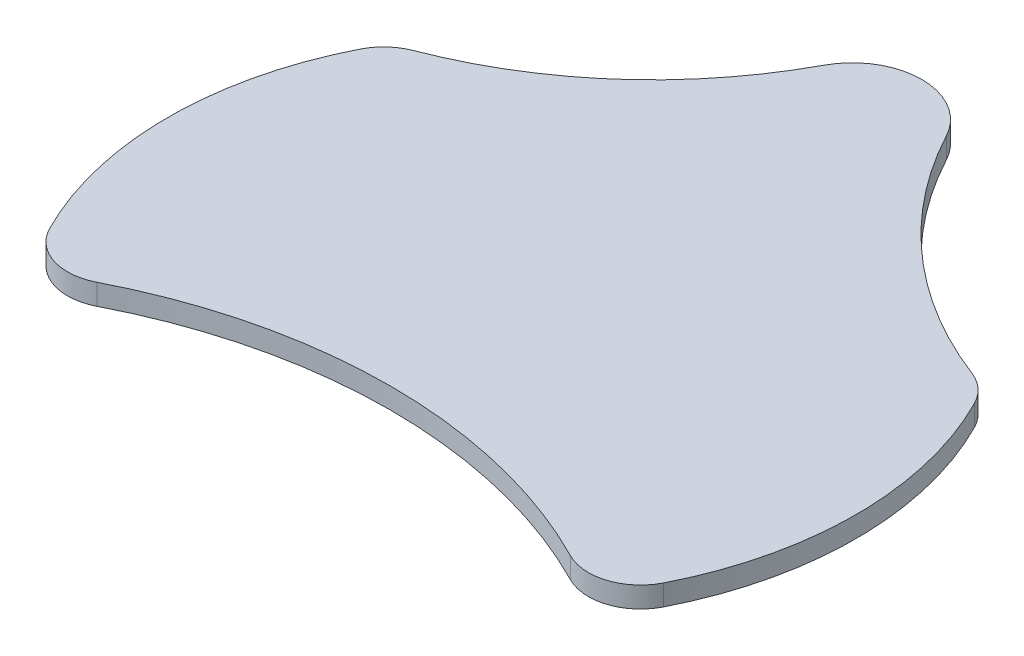
ISO-10303-21;
HEADER;
FILE_DESCRIPTION(('STEP AP214'),'2;1');
FILE_NAME('part.step','',(''),(''),'','','');
FILE_SCHEMA(('AUTOMOTIVE_DESIGN { 1 0 10303 214 1 1 1 1 }'));
ENDSEC;
DATA;
#1=APPLICATION_CONTEXT('core data for automotive mechanical design processes');
#2=APPLICATION_PROTOCOL_DEFINITION('international standard','automotive_design',2000,#1);
#3=PRODUCT_CONTEXT('',#1,'mechanical');
#4=PRODUCT('Part','Part','',(#3));
#5=PRODUCT_RELATED_PRODUCT_CATEGORY('part','',(#4));
#6=PRODUCT_DEFINITION_FORMATION('','',#4);
#7=PRODUCT_DEFINITION_CONTEXT('part definition',#1,'design');
#8=PRODUCT_DEFINITION('design','',#6,#7);
#9=PRODUCT_DEFINITION_SHAPE('','',#8);
#10=(LENGTH_UNIT() NAMED_UNIT(*) SI_UNIT(.MILLI.,.METRE.));
#11=(NAMED_UNIT(*) PLANE_ANGLE_UNIT() SI_UNIT($,.RADIAN.));
#12=(NAMED_UNIT(*) SI_UNIT($,.STERADIAN.) SOLID_ANGLE_UNIT());
#13=UNCERTAINTY_MEASURE_WITH_UNIT(LENGTH_MEASURE(1.E-05),#10,'distance_accuracy_value','');
#14=(GEOMETRIC_REPRESENTATION_CONTEXT(3) GLOBAL_UNCERTAINTY_ASSIGNED_CONTEXT((#13)) GLOBAL_UNIT_ASSIGNED_CONTEXT((#10,
#11,#12)) REPRESENTATION_CONTEXT('',''));
#15=CARTESIAN_POINT('',(0.,0.,0.));
#16=DIRECTION('',(0.,0.,1.));
#17=DIRECTION('',(1.,0.,0.));
#18=AXIS2_PLACEMENT_3D('',#15,#16,#17);
#19=CARTESIAN_POINT('',(61.7333117548628,3.,-62.9999730269119));
#20=DIRECTION('',(0.,-1.,0.));
#21=DIRECTION('',(0.,0.,-1.));
#22=AXIS2_PLACEMENT_3D('',#19,#20,#21);
#23=CYLINDRICAL_SURFACE('',#22,60.);
#24=CARTESIAN_POINT('',(61.7333117548628,0.,-62.9999730269119));
#25=DIRECTION('',(0.,1.,0.));
#26=DIRECTION('',(0.,0.,1.));
#27=AXIS2_PLACEMENT_3D('',#24,#25,#26);
#28=CIRCLE('',#27,60.);
#29=CARTESIAN_POINT('',(8.81904453640901,0.,-34.7142818609879));
#30=VERTEX_POINT('',#29);
#31=CARTESIAN_POINT('',(40.1925901949848,0.,-6.99999700299021));
#32=VERTEX_POINT('',#31);
#33=EDGE_CURVE('E187',#30,#32,#28,.T.);
#34=ORIENTED_EDGE('',*,*,#33,.F.);
#35=DIRECTION('',(0.,-1.,0.));
#36=VECTOR('',#35,1.);
#37=CARTESIAN_POINT('',(8.81904453640901,3.,-34.7142818609879));
#38=LINE('',#37,#36);
#39=CARTESIAN_POINT('',(8.81904453640901,3.,-34.7142818609879));
#40=VERTEX_POINT('',#39);
#41=EDGE_CURVE('E11',#40,#30,#38,.T.);
#42=ORIENTED_EDGE('',*,*,#41,.F.);
#43=CARTESIAN_POINT('',(61.7333117548628,3.,-62.9999730269119));
#44=DIRECTION('',(0.,1.,0.));
#45=DIRECTION('',(0.,0.,1.));
#46=AXIS2_PLACEMENT_3D('',#43,#44,#45);
#47=CIRCLE('',#46,60.);
#48=CARTESIAN_POINT('',(40.1925901949848,3.,-6.99999700299021));
#49=VERTEX_POINT('',#48);
#50=EDGE_CURVE('E152',#40,#49,#47,.T.);
#51=ORIENTED_EDGE('',*,*,#50,.T.);
#52=DIRECTION('',(0.,-1.,0.));
#53=VECTOR('',#52,1.);
#54=CARTESIAN_POINT('',(40.1925901949848,3.,-6.99999700299021));
#55=LINE('',#54,#53);
#56=EDGE_CURVE('E91',#49,#32,#55,.T.);
#57=ORIENTED_EDGE('',*,*,#56,.T.);
#58=EDGE_LOOP('',(#34,#42,#51,#57));
#59=FACE_BOUND('',#58,.T.);
#60=ADVANCED_FACE('F34',(#59),#23,.F.);
#61=CARTESIAN_POINT('',(0.,3.,-30.0000000000006));
#62=DIRECTION('',(0.,-1.,0.));
#63=DIRECTION('',(0.,0.,-1.));
#64=AXIS2_PLACEMENT_3D('',#61,#62,#63);
#65=CYLINDRICAL_SURFACE('',#64,10.);
#66=CARTESIAN_POINT('',(0.,0.,-30.0000000000006));
#67=DIRECTION('',(0.,1.,0.));
#68=DIRECTION('',(0.,0.,1.));
#69=AXIS2_PLACEMENT_3D('',#66,#67,#68);
#70=CIRCLE('',#69,10.);
#71=CARTESIAN_POINT('',(-8.81904453640901,0.,-34.7142818609879));
#72=VERTEX_POINT('',#71);
#73=EDGE_CURVE('E184',#30,#72,#70,.T.);
#74=ORIENTED_EDGE('',*,*,#73,.T.);
#75=DIRECTION('',(0.,-1.,0.));
#76=VECTOR('',#75,1.);
#77=CARTESIAN_POINT('',(-8.81904453640901,3.,-34.7142818609879));
#78=LINE('',#77,#76);
#79=CARTESIAN_POINT('',(-8.81904453640901,3.,-34.7142818609879));
#80=VERTEX_POINT('',#79);
#81=EDGE_CURVE('E42',#80,#72,#78,.T.);
#82=ORIENTED_EDGE('',*,*,#81,.F.);
#83=CARTESIAN_POINT('',(0.,3.,-30.0000000000006));
#84=DIRECTION('',(0.,1.,0.));
#85=DIRECTION('',(0.,0.,1.));
#86=AXIS2_PLACEMENT_3D('',#83,#84,#85);
#87=CIRCLE('',#86,10.);
#88=EDGE_CURVE('E148',#40,#80,#87,.T.);
#89=ORIENTED_EDGE('',*,*,#88,.F.);
#90=ORIENTED_EDGE('',*,*,#41,.T.);
#91=EDGE_LOOP('',(#74,#82,#89,#90));
#92=FACE_BOUND('',#91,.T.);
#93=ADVANCED_FACE('F185',(#92),#65,.T.);
#94=CARTESIAN_POINT('',(-61.7333117548628,3.,-62.9999730269119));
#95=DIRECTION('',(0.,-1.,0.));
#96=DIRECTION('',(0.,0.,-1.));
#97=AXIS2_PLACEMENT_3D('',#94,#95,#96);
#98=CYLINDRICAL_SURFACE('',#97,60.);
#99=CARTESIAN_POINT('',(-61.7333117548628,0.,-62.9999730269119));
#100=DIRECTION('',(0.,1.,0.));
#101=DIRECTION('',(0.,0.,1.));
#102=AXIS2_PLACEMENT_3D('',#99,#100,#101);
#103=CIRCLE('',#102,60.);
#104=CARTESIAN_POINT('',(-40.1925901949848,0.,-6.99999700299021));
#105=VERTEX_POINT('',#104);
#106=EDGE_CURVE('E181',#105,#72,#103,.T.);
#107=ORIENTED_EDGE('',*,*,#106,.F.);
#108=DIRECTION('',(0.,-1.,0.));
#109=VECTOR('',#108,1.);
#110=CARTESIAN_POINT('',(-40.1925901949848,3.,-6.99999700299021));
#111=LINE('',#110,#109);
#112=CARTESIAN_POINT('',(-40.1925901949848,3.,-6.99999700299021));
#113=VERTEX_POINT('',#112);
#114=EDGE_CURVE('E174',#113,#105,#111,.T.);
#115=ORIENTED_EDGE('',*,*,#114,.F.);
#116=CARTESIAN_POINT('',(-61.7333117548628,3.,-62.9999730269119));
#117=DIRECTION('',(0.,1.,0.));
#118=DIRECTION('',(0.,0.,1.));
#119=AXIS2_PLACEMENT_3D('',#116,#117,#118);
#120=CIRCLE('',#119,60.);
#121=EDGE_CURVE('E143',#113,#80,#120,.T.);
#122=ORIENTED_EDGE('',*,*,#121,.T.);
#123=ORIENTED_EDGE('',*,*,#81,.T.);
#124=EDGE_LOOP('',(#107,#115,#122,#123));
#125=FACE_BOUND('',#124,.T.);
#126=ADVANCED_FACE('F179',(#125),#98,.F.);
#127=CARTESIAN_POINT('',(-37.5,3.,0.));
#128=DIRECTION('',(0.,-1.,0.));
#129=DIRECTION('',(0.,0.,-1.));
#130=AXIS2_PLACEMENT_3D('',#127,#128,#129);
#131=CYLINDRICAL_SURFACE('',#130,7.5);
#132=CARTESIAN_POINT('',(-37.5,0.,0.));
#133=DIRECTION('',(0.,1.,0.));
#134=DIRECTION('',(0.,0.,1.));
#135=AXIS2_PLACEMENT_3D('',#132,#133,#134);
#136=CIRCLE('',#135,7.5);
#137=CARTESIAN_POINT('',(-44.190268320227,0.,-3.38973594891501));
#138=VERTEX_POINT('',#137);
#139=EDGE_CURVE('E192',#105,#138,#136,.T.);
#140=ORIENTED_EDGE('',*,*,#139,.T.);
#141=DIRECTION('',(0.,-1.,0.));
#142=VECTOR('',#141,1.);
#143=CARTESIAN_POINT('',(-44.190268320227,3.,-3.38973594891501));
#144=LINE('',#143,#142);
#145=CARTESIAN_POINT('',(-44.190268320227,3.,-3.38973594891501));
#146=VERTEX_POINT('',#145);
#147=EDGE_CURVE('E171',#146,#138,#144,.T.);
#148=ORIENTED_EDGE('',*,*,#147,.F.);
#149=CARTESIAN_POINT('',(-37.5,3.,0.));
#150=DIRECTION('',(0.,1.,0.));
#151=DIRECTION('',(0.,0.,1.));
#152=AXIS2_PLACEMENT_3D('',#149,#150,#151);
#153=CIRCLE('',#152,7.5);
#154=EDGE_CURVE('E140',#113,#146,#153,.T.);
#155=ORIENTED_EDGE('',*,*,#154,.F.);
#156=ORIENTED_EDGE('',*,*,#114,.T.);
#157=EDGE_LOOP('',(#140,#148,#155,#156));
#158=FACE_BOUND('',#157,.T.);
#159=ADVANCED_FACE('F212',(#158),#131,.T.);
#160=CARTESIAN_POINT('',(0.,3.,19.));
#161=DIRECTION('',(0.,-1.,0.));
#162=DIRECTION('',(0.,0.,-1.));
#163=AXIS2_PLACEMENT_3D('',#160,#161,#162);
#164=CYLINDRICAL_SURFACE('',#163,49.5386726717198);
#165=CARTESIAN_POINT('',(0.,0.,19.));
#166=DIRECTION('',(0.,1.,0.));
#167=DIRECTION('',(0.,0.,1.));
#168=AXIS2_PLACEMENT_3D('',#165,#166,#167);
#169=CIRCLE('',#168,49.5386726717198);
#170=CARTESIAN_POINT('',(-44.190268320227,0.,41.389735948915));
#171=VERTEX_POINT('',#170);
#172=EDGE_CURVE('E159',#138,#171,#169,.T.);
#173=ORIENTED_EDGE('',*,*,#172,.T.);
#174=DIRECTION('',(0.,-1.,0.));
#175=VECTOR('',#174,1.);
#176=CARTESIAN_POINT('',(-44.190268320227,3.,41.389735948915));
#177=LINE('',#176,#175);
#178=CARTESIAN_POINT('',(-44.190268320227,3.,41.389735948915));
#179=VERTEX_POINT('',#178);
#180=EDGE_CURVE('E168',#179,#171,#177,.T.);
#181=ORIENTED_EDGE('',*,*,#180,.F.);
#182=CARTESIAN_POINT('',(0.,3.,19.));
#183=DIRECTION('',(0.,1.,0.));
#184=DIRECTION('',(0.,0.,1.));
#185=AXIS2_PLACEMENT_3D('',#182,#183,#184);
#186=CIRCLE('',#185,49.5386726717198);
#187=EDGE_CURVE('E135',#146,#179,#186,.T.);
#188=ORIENTED_EDGE('',*,*,#187,.F.);
#189=ORIENTED_EDGE('',*,*,#147,.T.);
#190=EDGE_LOOP('',(#173,#181,#188,#189));
#191=FACE_BOUND('',#190,.T.);
#192=ADVANCED_FACE('F210',(#191),#164,.T.);
#193=CARTESIAN_POINT('',(-37.5,3.,38.));
#194=DIRECTION('',(0.,-1.,0.));
#195=DIRECTION('',(0.,0.,-1.));
#196=AXIS2_PLACEMENT_3D('',#193,#194,#195);
#197=CYLINDRICAL_SURFACE('',#196,7.5);
#198=CARTESIAN_POINT('',(-37.5,0.,38.));
#199=DIRECTION('',(0.,1.,0.));
#200=DIRECTION('',(0.,0.,1.));
#201=AXIS2_PLACEMENT_3D('',#198,#199,#200);
#202=CIRCLE('',#201,7.5);
#203=CARTESIAN_POINT('',(-34.0909090909091,0.,44.6804265712269));
#204=VERTEX_POINT('',#203);
#205=EDGE_CURVE('E197',#171,#204,#202,.T.);
#206=ORIENTED_EDGE('',*,*,#205,.T.);
#207=DIRECTION('',(0.,-1.,0.));
#208=VECTOR('',#207,1.);
#209=CARTESIAN_POINT('',(-34.0909090909091,3.,44.6804265712269));
#210=LINE('',#209,#208);
#211=CARTESIAN_POINT('',(-34.0909090909091,3.,44.6804265712269));
#212=VERTEX_POINT('',#211);
#213=EDGE_CURVE('E166',#212,#204,#210,.T.);
#214=ORIENTED_EDGE('',*,*,#213,.F.);
#215=CARTESIAN_POINT('',(-37.5,3.,38.));
#216=DIRECTION('',(0.,1.,0.));
#217=DIRECTION('',(0.,0.,1.));
#218=AXIS2_PLACEMENT_3D('',#215,#216,#217);
#219=CIRCLE('',#218,7.5);
#220=EDGE_CURVE('E139',#179,#212,#219,.T.);
#221=ORIENTED_EDGE('',*,*,#220,.F.);
#222=ORIENTED_EDGE('',*,*,#180,.T.);
#223=EDGE_LOOP('',(#206,#214,#221,#222));
#224=FACE_BOUND('',#223,.T.);
#225=ADVANCED_FACE('F208',(#224),#197,.T.);
#226=CARTESIAN_POINT('',(0.,3.,111.484692283495));
#227=DIRECTION('',(0.,-1.,0.));
#228=DIRECTION('',(0.,0.,-1.));
#229=AXIS2_PLACEMENT_3D('',#226,#227,#228);
#230=CYLINDRICAL_SURFACE('',#229,75.);
#231=CARTESIAN_POINT('',(0.,0.,111.484692283495));
#232=DIRECTION('',(0.,1.,0.));
#233=DIRECTION('',(0.,0.,1.));
#234=AXIS2_PLACEMENT_3D('',#231,#232,#233);
#235=CIRCLE('',#234,75.);
#236=CARTESIAN_POINT('',(34.0909090909091,0.,44.6804265712269));
#237=VERTEX_POINT('',#236);
#238=EDGE_CURVE('E199',#237,#204,#235,.T.);
#239=ORIENTED_EDGE('',*,*,#238,.F.);
#240=DIRECTION('',(0.,-1.,0.));
#241=VECTOR('',#240,1.);
#242=CARTESIAN_POINT('',(34.0909090909091,3.,44.6804265712269));
#243=LINE('',#242,#241);
#244=CARTESIAN_POINT('',(34.0909090909091,3.,44.6804265712269));
#245=VERTEX_POINT('',#244);
#246=EDGE_CURVE('E130',#245,#237,#243,.T.);
#247=ORIENTED_EDGE('',*,*,#246,.F.);
#248=CARTESIAN_POINT('',(0.,3.,111.484692283495));
#249=DIRECTION('',(0.,1.,0.));
#250=DIRECTION('',(0.,0.,1.));
#251=AXIS2_PLACEMENT_3D('',#248,#249,#250);
#252=CIRCLE('',#251,75.);
#253=EDGE_CURVE('E123',#245,#212,#252,.T.);
#254=ORIENTED_EDGE('',*,*,#253,.T.);
#255=ORIENTED_EDGE('',*,*,#213,.T.);
#256=EDGE_LOOP('',(#239,#247,#254,#255));
#257=FACE_BOUND('',#256,.T.);
#258=ADVANCED_FACE('F204',(#257),#230,.F.);
#259=CARTESIAN_POINT('',(37.5,3.,38.));
#260=DIRECTION('',(0.,-1.,0.));
#261=DIRECTION('',(0.,0.,-1.));
#262=AXIS2_PLACEMENT_3D('',#259,#260,#261);
#263=CYLINDRICAL_SURFACE('',#262,7.5);
#264=CARTESIAN_POINT('',(37.5,0.,38.));
#265=DIRECTION('',(0.,1.,0.));
#266=DIRECTION('',(0.,0.,1.));
#267=AXIS2_PLACEMENT_3D('',#264,#265,#266);
#268=CIRCLE('',#267,7.5);
#269=CARTESIAN_POINT('',(44.190268320227,0.,41.389735948915));
#270=VERTEX_POINT('',#269);
#271=EDGE_CURVE('E129',#237,#270,#268,.T.);
#272=ORIENTED_EDGE('',*,*,#271,.T.);
#273=DIRECTION('',(0.,-1.,0.));
#274=VECTOR('',#273,1.);
#275=CARTESIAN_POINT('',(44.190268320227,3.,41.389735948915));
#276=LINE('',#275,#274);
#277=CARTESIAN_POINT('',(44.190268320227,3.,41.389735948915));
#278=VERTEX_POINT('',#277);
#279=EDGE_CURVE('E126',#278,#270,#276,.T.);
#280=ORIENTED_EDGE('',*,*,#279,.F.);
#281=CARTESIAN_POINT('',(37.5,3.,38.));
#282=DIRECTION('',(0.,1.,0.));
#283=DIRECTION('',(0.,0.,1.));
#284=AXIS2_PLACEMENT_3D('',#281,#282,#283);
#285=CIRCLE('',#284,7.5);
#286=EDGE_CURVE('E117',#245,#278,#285,.T.);
#287=ORIENTED_EDGE('',*,*,#286,.F.);
#288=ORIENTED_EDGE('',*,*,#246,.T.);
#289=EDGE_LOOP('',(#272,#280,#287,#288));
#290=FACE_BOUND('',#289,.T.);
#291=ADVANCED_FACE('F127',(#290),#263,.T.);
#292=CARTESIAN_POINT('',(44.190268320227,0.,-3.38973594891502));
#293=VERTEX_POINT('',#292);
#294=EDGE_CURVE('E84',#270,#293,#169,.T.);
#295=ORIENTED_EDGE('',*,*,#294,.T.);
#296=DIRECTION('',(0.,-1.,0.));
#297=VECTOR('',#296,1.);
#298=CARTESIAN_POINT('',(44.190268320227,3.,-3.38973594891502));
#299=LINE('',#298,#297);
#300=CARTESIAN_POINT('',(44.190268320227,3.,-3.38973594891502));
#301=VERTEX_POINT('',#300);
#302=EDGE_CURVE('E131',#301,#293,#299,.T.);
#303=ORIENTED_EDGE('',*,*,#302,.F.);
#304=EDGE_CURVE('E121',#278,#301,#186,.T.);
#305=ORIENTED_EDGE('',*,*,#304,.F.);
#306=ORIENTED_EDGE('',*,*,#279,.T.);
#307=EDGE_LOOP('',(#295,#303,#305,#306));
#308=FACE_BOUND('',#307,.T.);
#309=ADVANCED_FACE('F133',(#308),#164,.T.);
#310=CARTESIAN_POINT('',(37.5,3.,0.));
#311=DIRECTION('',(0.,-1.,0.));
#312=DIRECTION('',(0.,0.,-1.));
#313=AXIS2_PLACEMENT_3D('',#310,#311,#312);
#314=CYLINDRICAL_SURFACE('',#313,7.5);
#315=CARTESIAN_POINT('',(37.5,0.,0.));
#316=DIRECTION('',(0.,1.,0.));
#317=DIRECTION('',(0.,0.,1.));
#318=AXIS2_PLACEMENT_3D('',#315,#316,#317);
#319=CIRCLE('',#318,7.5);
#320=EDGE_CURVE('E153',#293,#32,#319,.T.);
#321=ORIENTED_EDGE('',*,*,#320,.T.);
#322=ORIENTED_EDGE('',*,*,#56,.F.);
#323=CARTESIAN_POINT('',(37.5,3.,0.));
#324=DIRECTION('',(0.,1.,0.));
#325=DIRECTION('',(0.,0.,1.));
#326=AXIS2_PLACEMENT_3D('',#323,#324,#325);
#327=CIRCLE('',#326,7.5);
#328=EDGE_CURVE('E50',#301,#49,#327,.T.);
#329=ORIENTED_EDGE('',*,*,#328,.F.);
#330=ORIENTED_EDGE('',*,*,#302,.T.);
#331=EDGE_LOOP('',(#321,#322,#329,#330));
#332=FACE_BOUND('',#331,.T.);
#333=ADVANCED_FACE('F275',(#332),#314,.T.);
#334=CARTESIAN_POINT('',(0.,3.,0.));
#335=DIRECTION('',(0.,1.,0.));
#336=DIRECTION('',(0.,0.,1.));
#337=AXIS2_PLACEMENT_3D('',#334,#335,#336);
#338=PLANE('',#337);
#339=ORIENTED_EDGE('',*,*,#50,.F.);
#340=ORIENTED_EDGE('',*,*,#88,.T.);
#341=ORIENTED_EDGE('',*,*,#121,.F.);
#342=ORIENTED_EDGE('',*,*,#154,.T.);
#343=ORIENTED_EDGE('',*,*,#187,.T.);
#344=ORIENTED_EDGE('',*,*,#220,.T.);
#345=ORIENTED_EDGE('',*,*,#253,.F.);
#346=ORIENTED_EDGE('',*,*,#286,.T.);
#347=ORIENTED_EDGE('',*,*,#304,.T.);
#348=ORIENTED_EDGE('',*,*,#328,.T.);
#349=EDGE_LOOP('',(#339,#340,#341,#342,#343,#344,#345,#346,#347,#348));
#350=FACE_BOUND('',#349,.T.);
#351=ADVANCED_FACE('F119',(#350),#338,.T.);
#352=CARTESIAN_POINT('',(0.,0.,0.));
#353=DIRECTION('',(0.,1.,0.));
#354=DIRECTION('',(0.,0.,1.));
#355=AXIS2_PLACEMENT_3D('',#352,#353,#354);
#356=PLANE('',#355);
#357=ORIENTED_EDGE('',*,*,#33,.T.);
#358=ORIENTED_EDGE('',*,*,#320,.F.);
#359=ORIENTED_EDGE('',*,*,#294,.F.);
#360=ORIENTED_EDGE('',*,*,#271,.F.);
#361=ORIENTED_EDGE('',*,*,#238,.T.);
#362=ORIENTED_EDGE('',*,*,#205,.F.);
#363=ORIENTED_EDGE('',*,*,#172,.F.);
#364=ORIENTED_EDGE('',*,*,#139,.F.);
#365=ORIENTED_EDGE('',*,*,#106,.T.);
#366=ORIENTED_EDGE('',*,*,#73,.F.);
#367=EDGE_LOOP('',(#357,#358,#359,#360,#361,#362,#363,#364,#365,#366));
#368=FACE_BOUND('',#367,.T.);
#369=ADVANCED_FACE('F190',(#368),#356,.F.);
#370=CLOSED_SHELL('',(#60,#93,#126,#159,#192,#225,#258,#291,#309,#333,#351,#369));
#371=MANIFOLD_SOLID_BREP('B2',#370);
#372=ADVANCED_BREP_SHAPE_REPRESENTATION('',(#18,#371),#14);
#373=SHAPE_DEFINITION_REPRESENTATION(#9,#372);
ENDSEC;
END-ISO-10303-21;
